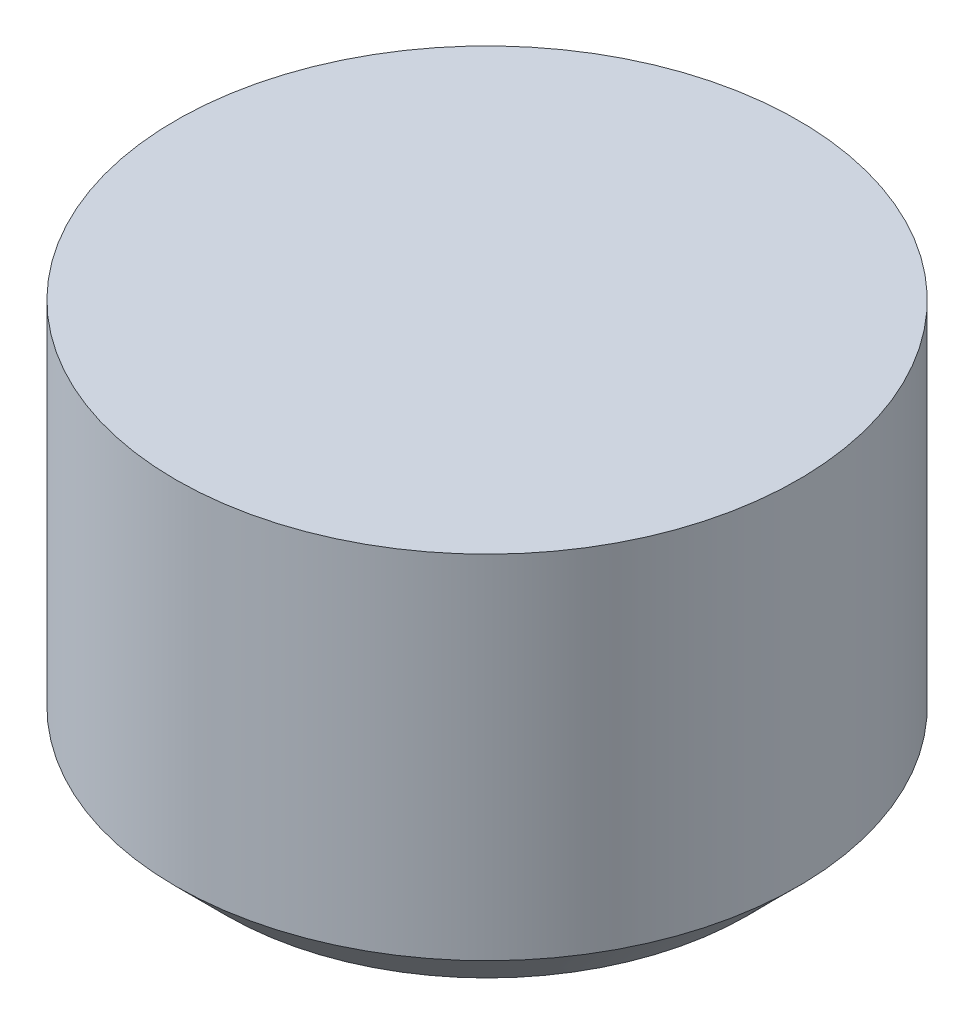
ISO-10303-21;
HEADER;
FILE_DESCRIPTION(('STEP AP214'),'2;1');
FILE_NAME('part.step','',(''),(''),'','','');
FILE_SCHEMA(('AUTOMOTIVE_DESIGN { 1 0 10303 214 1 1 1 1 }'));
ENDSEC;
DATA;
#1=APPLICATION_CONTEXT('core data for automotive mechanical design processes');
#2=APPLICATION_PROTOCOL_DEFINITION('international standard','automotive_design',2000,#1);
#3=PRODUCT_CONTEXT('',#1,'mechanical');
#4=PRODUCT('Part','Part','',(#3));
#5=PRODUCT_RELATED_PRODUCT_CATEGORY('part','',(#4));
#6=PRODUCT_DEFINITION_FORMATION('','',#4);
#7=PRODUCT_DEFINITION_CONTEXT('part definition',#1,'design');
#8=PRODUCT_DEFINITION('design','',#6,#7);
#9=PRODUCT_DEFINITION_SHAPE('','',#8);
#10=(LENGTH_UNIT() NAMED_UNIT(*) SI_UNIT(.MILLI.,.METRE.));
#11=(NAMED_UNIT(*) PLANE_ANGLE_UNIT() SI_UNIT($,.RADIAN.));
#12=(NAMED_UNIT(*) SI_UNIT($,.STERADIAN.) SOLID_ANGLE_UNIT());
#13=UNCERTAINTY_MEASURE_WITH_UNIT(LENGTH_MEASURE(1.E-05),#10,'distance_accuracy_value','');
#14=(GEOMETRIC_REPRESENTATION_CONTEXT(3) GLOBAL_UNCERTAINTY_ASSIGNED_CONTEXT((#13)) GLOBAL_UNIT_ASSIGNED_CONTEXT((#10,
#11,#12)) REPRESENTATION_CONTEXT('',''));
#15=CARTESIAN_POINT('',(0.,0.,0.));
#16=DIRECTION('',(0.,0.,1.));
#17=DIRECTION('',(1.,0.,0.));
#18=AXIS2_PLACEMENT_3D('',#15,#16,#17);
#19=CARTESIAN_POINT('',(0.,0.,0.));
#20=DIRECTION('',(0.,1.,0.));
#21=DIRECTION('',(0.,0.,1.));
#22=AXIS2_PLACEMENT_3D('',#19,#20,#21);
#23=PLANE('',#22);
#24=CARTESIAN_POINT('',(0.,0.,0.));
#25=DIRECTION('',(0.,1.,0.));
#26=DIRECTION('',(0.,0.,1.));
#27=AXIS2_PLACEMENT_3D('',#24,#25,#26);
#28=CIRCLE('',#27,10.2);
#29=CARTESIAN_POINT('',(0.,0.,10.2));
#30=VERTEX_POINT('',#29);
#31=EDGE_CURVE('E40',#30,#30,#28,.F.);
#32=ORIENTED_EDGE('',*,*,#31,.T.);
#33=EDGE_LOOP('',(#32));
#34=FACE_BOUND('',#33,.T.);
#35=CARTESIAN_POINT('',(0.,0.,0.));
#36=DIRECTION('',(0.,1.,0.));
#37=DIRECTION('',(0.,0.,1.));
#38=AXIS2_PLACEMENT_3D('',#35,#36,#37);
#39=CIRCLE('',#38,3.);
#40=CARTESIAN_POINT('',(0.,0.,3.));
#41=VERTEX_POINT('',#40);
#42=EDGE_CURVE('E10',#41,#41,#39,.F.);
#43=ORIENTED_EDGE('',*,*,#42,.F.);
#44=EDGE_LOOP('',(#43));
#45=FACE_BOUND('',#44,.T.);
#46=ADVANCED_FACE('F33',(#34,#45),#23,.F.);
#47=CARTESIAN_POINT('',(0.,15.8,0.));
#48=DIRECTION('',(0.,-1.,0.));
#49=DIRECTION('',(0.,0.,-1.));
#50=AXIS2_PLACEMENT_3D('',#47,#48,#49);
#51=CYLINDRICAL_SURFACE('',#50,12.2);
#52=CARTESIAN_POINT('',(0.,2.,0.));
#53=DIRECTION('',(0.,1.,0.));
#54=DIRECTION('',(0.,0.,1.));
#55=AXIS2_PLACEMENT_3D('',#52,#53,#54);
#56=CIRCLE('',#55,12.2);
#57=CARTESIAN_POINT('',(0.,2.,12.2));
#58=VERTEX_POINT('',#57);
#59=EDGE_CURVE('E44',#58,#58,#56,.T.);
#60=ORIENTED_EDGE('',*,*,#59,.T.);
#61=EDGE_LOOP('',(#60));
#62=FACE_BOUND('',#61,.T.);
#63=CARTESIAN_POINT('',(0.,15.8,0.));
#64=DIRECTION('',(0.,1.,0.));
#65=DIRECTION('',(0.,0.,1.));
#66=AXIS2_PLACEMENT_3D('',#63,#64,#65);
#67=CIRCLE('',#66,12.2);
#68=CARTESIAN_POINT('',(0.,15.8,12.2));
#69=VERTEX_POINT('',#68);
#70=EDGE_CURVE('E48',#69,#69,#67,.T.);
#71=ORIENTED_EDGE('',*,*,#70,.F.);
#72=EDGE_LOOP('',(#71));
#73=FACE_BOUND('',#72,.T.);
#74=ADVANCED_FACE('F71',(#62,#73),#51,.T.);
#75=CARTESIAN_POINT('',(0.,15.8,0.));
#76=DIRECTION('',(0.,1.,0.));
#77=DIRECTION('',(0.,0.,1.));
#78=AXIS2_PLACEMENT_3D('',#75,#76,#77);
#79=PLANE('',#78);
#80=ORIENTED_EDGE('',*,*,#70,.T.);
#81=EDGE_LOOP('',(#80));
#82=FACE_BOUND('',#81,.T.);
#83=ADVANCED_FACE('F67',(#82),#79,.T.);
#84=CARTESIAN_POINT('',(0.,2.,0.));
#85=DIRECTION('',(0.,1.,0.));
#86=DIRECTION('',(0.,0.,1.));
#87=AXIS2_PLACEMENT_3D('',#84,#85,#86);
#88=CONICAL_SURFACE('',#87,12.2,0.785398163397449);
#89=ORIENTED_EDGE('',*,*,#31,.F.);
#90=EDGE_LOOP('',(#89));
#91=FACE_BOUND('',#90,.T.);
#92=ORIENTED_EDGE('',*,*,#59,.F.);
#93=EDGE_LOOP('',(#92));
#94=FACE_BOUND('',#93,.T.);
#95=ADVANCED_FACE('F35',(#91,#94),#88,.T.);
#96=CARTESIAN_POINT('',(0.,-4.,0.));
#97=DIRECTION('',(0.,1.,0.));
#98=DIRECTION('',(0.,0.,1.));
#99=AXIS2_PLACEMENT_3D('',#96,#97,#98);
#100=CYLINDRICAL_SURFACE('',#99,3.);
#101=CARTESIAN_POINT('',(0.,-4.,0.));
#102=DIRECTION('',(0.,-1.,0.));
#103=DIRECTION('',(0.,0.,-1.));
#104=AXIS2_PLACEMENT_3D('',#101,#102,#103);
#105=CIRCLE('',#104,3.);
#106=CARTESIAN_POINT('',(0.,-4.,-3.));
#107=VERTEX_POINT('',#106);
#108=EDGE_CURVE('E53',#107,#107,#105,.T.);
#109=ORIENTED_EDGE('',*,*,#108,.F.);
#110=EDGE_LOOP('',(#109));
#111=FACE_BOUND('',#110,.T.);
#112=ORIENTED_EDGE('',*,*,#42,.T.);
#113=EDGE_LOOP('',(#112));
#114=FACE_BOUND('',#113,.T.);
#115=ADVANCED_FACE('F59',(#111,#114),#100,.T.);
#116=CARTESIAN_POINT('',(0.,-4.,0.));
#117=DIRECTION('',(0.,-1.,0.));
#118=DIRECTION('',(0.,0.,-1.));
#119=AXIS2_PLACEMENT_3D('',#116,#117,#118);
#120=PLANE('',#119);
#121=ORIENTED_EDGE('',*,*,#108,.T.);
#122=EDGE_LOOP('',(#121));
#123=FACE_BOUND('',#122,.T.);
#124=ADVANCED_FACE('F57',(#123),#120,.T.);
#125=CLOSED_SHELL('',(#46,#74,#83,#95,#115,#124));
#126=MANIFOLD_SOLID_BREP('B2',#125);
#127=ADVANCED_BREP_SHAPE_REPRESENTATION('',(#18,#126),#14);
#128=SHAPE_DEFINITION_REPRESENTATION(#9,#127);
ENDSEC;
END-ISO-10303-21;
